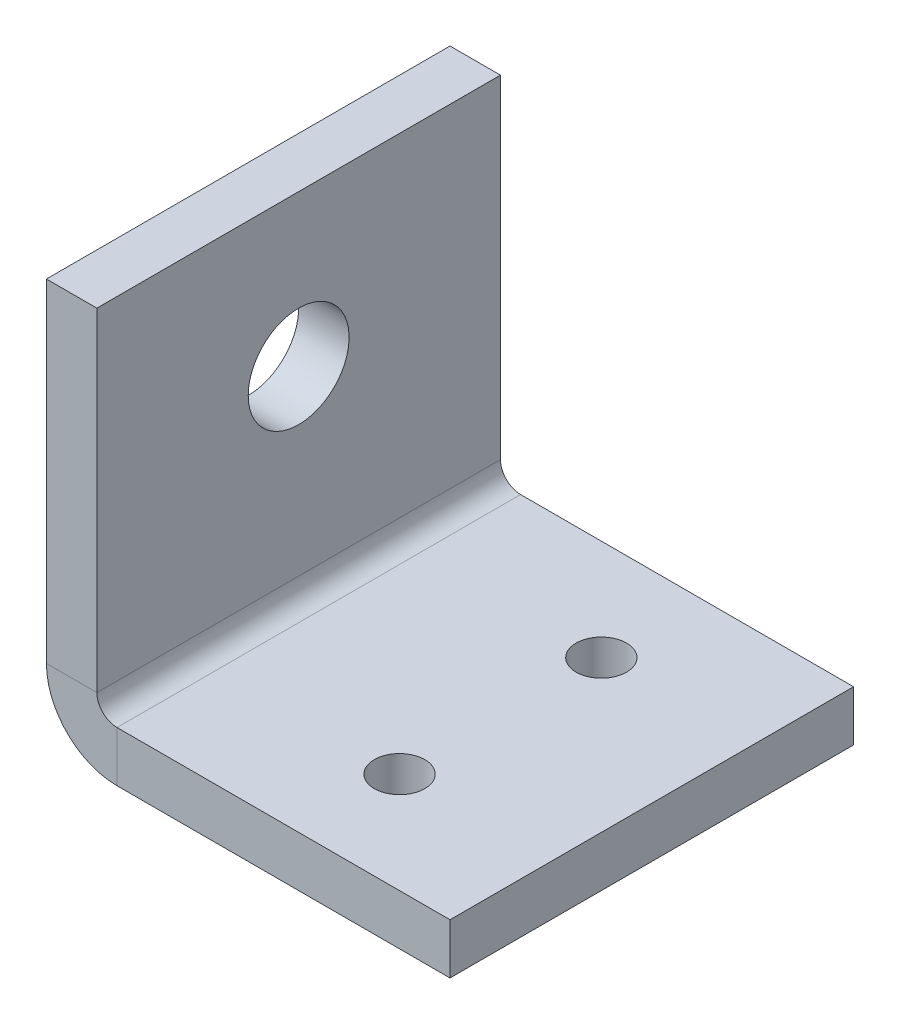
ISO-10303-21;
HEADER;
FILE_DESCRIPTION(('STEP AP214'),'2;1');
FILE_NAME('part.step','',(''),(''),'','','');
FILE_SCHEMA(('AUTOMOTIVE_DESIGN { 1 0 10303 214 1 1 1 1 }'));
ENDSEC;
DATA;
#1=APPLICATION_CONTEXT('core data for automotive mechanical design processes');
#2=APPLICATION_PROTOCOL_DEFINITION('international standard','automotive_design',2000,#1);
#3=PRODUCT_CONTEXT('',#1,'mechanical');
#4=PRODUCT('Part','Part','',(#3));
#5=PRODUCT_RELATED_PRODUCT_CATEGORY('part','',(#4));
#6=PRODUCT_DEFINITION_FORMATION('','',#4);
#7=PRODUCT_DEFINITION_CONTEXT('part definition',#1,'design');
#8=PRODUCT_DEFINITION('design','',#6,#7);
#9=PRODUCT_DEFINITION_SHAPE('','',#8);
#10=(LENGTH_UNIT() NAMED_UNIT(*) SI_UNIT(.MILLI.,.METRE.));
#11=(NAMED_UNIT(*) PLANE_ANGLE_UNIT() SI_UNIT($,.RADIAN.));
#12=(NAMED_UNIT(*) SI_UNIT($,.STERADIAN.) SOLID_ANGLE_UNIT());
#13=UNCERTAINTY_MEASURE_WITH_UNIT(LENGTH_MEASURE(1.E-05),#10,'distance_accuracy_value','');
#14=(GEOMETRIC_REPRESENTATION_CONTEXT(3) GLOBAL_UNCERTAINTY_ASSIGNED_CONTEXT((#13)) GLOBAL_UNIT_ASSIGNED_CONTEXT((#10,
#11,#12)) REPRESENTATION_CONTEXT('',''));
#15=CARTESIAN_POINT('',(0.,0.,0.));
#16=DIRECTION('',(0.,0.,1.));
#17=DIRECTION('',(1.,0.,0.));
#18=AXIS2_PLACEMENT_3D('',#15,#16,#17);
#19=CARTESIAN_POINT('',(-33.,0.,-20.));
#20=DIRECTION('',(0.,0.,-1.));
#21=DIRECTION('',(-1.,0.,0.));
#22=AXIS2_PLACEMENT_3D('',#19,#20,#21);
#23=PLANE('',#22);
#24=DIRECTION('',(0.,1.,0.));
#25=VECTOR('',#24,1.);
#26=CARTESIAN_POINT('',(-33.,0.,-20.));
#27=LINE('',#26,#25);
#28=CARTESIAN_POINT('',(-33.,0.,-20.));
#29=VERTEX_POINT('',#28);
#30=CARTESIAN_POINT('',(-33.,5.,-20.));
#31=VERTEX_POINT('',#30);
#32=EDGE_CURVE('E11',#29,#31,#27,.T.);
#33=ORIENTED_EDGE('',*,*,#32,.F.);
#34=CARTESIAN_POINT('',(-33.,7.,-20.));
#35=DIRECTION('',(0.,0.,1.));
#36=DIRECTION('',(1.,0.,0.));
#37=AXIS2_PLACEMENT_3D('',#34,#35,#36);
#38=CIRCLE('',#37,7.);
#39=CARTESIAN_POINT('',(-40.,7.,-20.));
#40=VERTEX_POINT('',#39);
#41=EDGE_CURVE('E218',#29,#40,#38,.F.);
#42=ORIENTED_EDGE('',*,*,#41,.T.);
#43=DIRECTION('',(-1.,0.,0.));
#44=VECTOR('',#43,1.);
#45=CARTESIAN_POINT('',(-35.,7.,-20.));
#46=LINE('',#45,#44);
#47=CARTESIAN_POINT('',(-35.,7.,-20.));
#48=VERTEX_POINT('',#47);
#49=EDGE_CURVE('E55',#48,#40,#46,.T.);
#50=ORIENTED_EDGE('',*,*,#49,.F.);
#51=CARTESIAN_POINT('',(-33.,7.,-20.));
#52=DIRECTION('',(0.,0.,1.));
#53=DIRECTION('',(1.,0.,0.));
#54=AXIS2_PLACEMENT_3D('',#51,#52,#53);
#55=CIRCLE('',#54,2.);
#56=EDGE_CURVE('E147',#31,#48,#55,.F.);
#57=ORIENTED_EDGE('',*,*,#56,.F.);
#58=EDGE_LOOP('',(#33,#42,#50,#57));
#59=FACE_BOUND('',#58,.T.);
#60=ADVANCED_FACE('F46',(#59),#23,.T.);
#61=CARTESIAN_POINT('',(-35.,7.,-20.));
#62=DIRECTION('',(0.,0.,-1.));
#63=DIRECTION('',(-1.,0.,0.));
#64=AXIS2_PLACEMENT_3D('',#61,#62,#63);
#65=PLANE('',#64);
#66=DIRECTION('',(-1.,0.,0.));
#67=VECTOR('',#66,1.);
#68=CARTESIAN_POINT('',(0.,0.,-20.));
#69=LINE('',#68,#67);
#70=CARTESIAN_POINT('',(0.,0.,-20.));
#71=VERTEX_POINT('',#70);
#72=EDGE_CURVE('E142',#71,#29,#69,.T.);
#73=ORIENTED_EDGE('',*,*,#72,.T.);
#74=ORIENTED_EDGE('',*,*,#32,.T.);
#75=DIRECTION('',(1.,0.,0.));
#76=VECTOR('',#75,1.);
#77=CARTESIAN_POINT('',(0.,5.,-20.));
#78=LINE('',#77,#76);
#79=CARTESIAN_POINT('',(0.,5.,-20.));
#80=VERTEX_POINT('',#79);
#81=EDGE_CURVE('E125',#80,#31,#78,.F.);
#82=ORIENTED_EDGE('',*,*,#81,.F.);
#83=DIRECTION('',(0.,-1.,0.));
#84=VECTOR('',#83,1.);
#85=CARTESIAN_POINT('',(0.,5.,-20.));
#86=LINE('',#85,#84);
#87=EDGE_CURVE('E135',#80,#71,#86,.T.);
#88=ORIENTED_EDGE('',*,*,#87,.T.);
#89=EDGE_LOOP('',(#73,#74,#82,#88));
#90=FACE_BOUND('',#89,.T.);
#91=ADVANCED_FACE('F144',(#90),#65,.T.);
#92=CARTESIAN_POINT('',(-40.,7.,20.));
#93=DIRECTION('',(0.,0.,1.));
#94=DIRECTION('',(1.,0.,0.));
#95=AXIS2_PLACEMENT_3D('',#92,#93,#94);
#96=PLANE('',#95);
#97=DIRECTION('',(1.,0.,0.));
#98=VECTOR('',#97,1.);
#99=CARTESIAN_POINT('',(-40.,7.,20.));
#100=LINE('',#99,#98);
#101=CARTESIAN_POINT('',(-40.,7.,20.));
#102=VERTEX_POINT('',#101);
#103=CARTESIAN_POINT('',(-35.,7.,20.));
#104=VERTEX_POINT('',#103);
#105=EDGE_CURVE('E97',#102,#104,#100,.T.);
#106=ORIENTED_EDGE('',*,*,#105,.F.);
#107=CARTESIAN_POINT('',(-33.,7.,20.));
#108=DIRECTION('',(0.,0.,1.));
#109=DIRECTION('',(1.,0.,0.));
#110=AXIS2_PLACEMENT_3D('',#107,#108,#109);
#111=CIRCLE('',#110,7.);
#112=CARTESIAN_POINT('',(-33.,0.,20.));
#113=VERTEX_POINT('',#112);
#114=EDGE_CURVE('E168',#113,#102,#111,.F.);
#115=ORIENTED_EDGE('',*,*,#114,.F.);
#116=DIRECTION('',(0.,-1.,0.));
#117=VECTOR('',#116,1.);
#118=CARTESIAN_POINT('',(-33.,5.,20.));
#119=LINE('',#118,#117);
#120=CARTESIAN_POINT('',(-33.,5.,20.));
#121=VERTEX_POINT('',#120);
#122=EDGE_CURVE('E90',#121,#113,#119,.T.);
#123=ORIENTED_EDGE('',*,*,#122,.F.);
#124=CARTESIAN_POINT('',(-33.,7.,20.));
#125=DIRECTION('',(0.,0.,1.));
#126=DIRECTION('',(1.,0.,0.));
#127=AXIS2_PLACEMENT_3D('',#124,#125,#126);
#128=CIRCLE('',#127,2.);
#129=EDGE_CURVE('E181',#121,#104,#128,.F.);
#130=ORIENTED_EDGE('',*,*,#129,.T.);
#131=EDGE_LOOP('',(#106,#115,#123,#130));
#132=FACE_BOUND('',#131,.T.);
#133=ADVANCED_FACE('F240',(#132),#96,.T.);
#134=CARTESIAN_POINT('',(-33.,5.,20.));
#135=DIRECTION('',(0.,0.,1.));
#136=DIRECTION('',(1.,0.,0.));
#137=AXIS2_PLACEMENT_3D('',#134,#135,#136);
#138=PLANE('',#137);
#139=DIRECTION('',(0.,1.,0.));
#140=VECTOR('',#139,1.);
#141=CARTESIAN_POINT('',(-40.,0.,20.));
#142=LINE('',#141,#140);
#143=CARTESIAN_POINT('',(-40.,40.,20.));
#144=VERTEX_POINT('',#143);
#145=EDGE_CURVE('E165',#102,#144,#142,.T.);
#146=ORIENTED_EDGE('',*,*,#145,.F.);
#147=ORIENTED_EDGE('',*,*,#105,.T.);
#148=DIRECTION('',(0.,1.,0.));
#149=VECTOR('',#148,1.);
#150=CARTESIAN_POINT('',(-35.,0.,20.));
#151=LINE('',#150,#149);
#152=CARTESIAN_POINT('',(-35.,40.,20.));
#153=VERTEX_POINT('',#152);
#154=EDGE_CURVE('E157',#104,#153,#151,.T.);
#155=ORIENTED_EDGE('',*,*,#154,.T.);
#156=DIRECTION('',(1.,0.,0.));
#157=VECTOR('',#156,1.);
#158=CARTESIAN_POINT('',(-40.,40.,20.));
#159=LINE('',#158,#157);
#160=EDGE_CURVE('E160',#144,#153,#159,.T.);
#161=ORIENTED_EDGE('',*,*,#160,.F.);
#162=EDGE_LOOP('',(#146,#147,#155,#161));
#163=FACE_BOUND('',#162,.T.);
#164=ADVANCED_FACE('F248',(#163),#138,.T.);
#165=CARTESIAN_POINT('',(-35.,0.,-20.));
#166=DIRECTION('',(1.,0.,0.));
#167=DIRECTION('',(0.,0.,-1.));
#168=AXIS2_PLACEMENT_3D('',#165,#166,#167);
#169=PLANE('',#168);
#170=CARTESIAN_POINT('',(-35.,25.,0.));
#171=DIRECTION('',(-1.,0.,0.));
#172=DIRECTION('',(0.,0.,1.));
#173=AXIS2_PLACEMENT_3D('',#170,#171,#172);
#174=CIRCLE('',#173,5.);
#175=CARTESIAN_POINT('',(-35.,25.,5.));
#176=VERTEX_POINT('',#175);
#177=EDGE_CURVE('E161',#176,#176,#174,.T.);
#178=ORIENTED_EDGE('',*,*,#177,.T.);
#179=EDGE_LOOP('',(#178));
#180=FACE_BOUND('',#179,.T.);
#181=ORIENTED_EDGE('',*,*,#154,.F.);
#182=DIRECTION('',(0.,0.,1.));
#183=VECTOR('',#182,1.);
#184=CARTESIAN_POINT('',(-35.,7.,-20.));
#185=LINE('',#184,#183);
#186=EDGE_CURVE('E185',#48,#104,#185,.T.);
#187=ORIENTED_EDGE('',*,*,#186,.F.);
#188=DIRECTION('',(0.,1.,0.));
#189=VECTOR('',#188,1.);
#190=CARTESIAN_POINT('',(-35.,0.,-20.));
#191=LINE('',#190,#189);
#192=CARTESIAN_POINT('',(-35.,40.,-20.));
#193=VERTEX_POINT('',#192);
#194=EDGE_CURVE('E184',#48,#193,#191,.T.);
#195=ORIENTED_EDGE('',*,*,#194,.T.);
#196=DIRECTION('',(0.,0.,1.));
#197=VECTOR('',#196,1.);
#198=CARTESIAN_POINT('',(-35.,40.,-20.));
#199=LINE('',#198,#197);
#200=EDGE_CURVE('E153',#193,#153,#199,.T.);
#201=ORIENTED_EDGE('',*,*,#200,.T.);
#202=EDGE_LOOP('',(#181,#187,#195,#201));
#203=FACE_BOUND('',#202,.T.);
#204=ADVANCED_FACE('F246',(#180,#203),#169,.T.);
#205=CARTESIAN_POINT('',(-33.,7.,-20.));
#206=DIRECTION('',(0.,0.,1.));
#207=DIRECTION('',(1.,0.,0.));
#208=AXIS2_PLACEMENT_3D('',#205,#206,#207);
#209=CYLINDRICAL_SURFACE('',#208,2.);
#210=ORIENTED_EDGE('',*,*,#129,.F.);
#211=DIRECTION('',(0.,0.,1.));
#212=VECTOR('',#211,1.);
#213=CARTESIAN_POINT('',(-33.,5.,-20.));
#214=LINE('',#213,#212);
#215=EDGE_CURVE('E131',#31,#121,#214,.T.);
#216=ORIENTED_EDGE('',*,*,#215,.F.);
#217=ORIENTED_EDGE('',*,*,#56,.T.);
#218=ORIENTED_EDGE('',*,*,#186,.T.);
#219=EDGE_LOOP('',(#210,#216,#217,#218));
#220=FACE_BOUND('',#219,.T.);
#221=ADVANCED_FACE('F243',(#220),#209,.F.);
#222=CARTESIAN_POINT('',(0.,5.,-20.));
#223=DIRECTION('',(0.,1.,0.));
#224=DIRECTION('',(0.,0.,1.));
#225=AXIS2_PLACEMENT_3D('',#222,#223,#224);
#226=PLANE('',#225);
#227=CARTESIAN_POINT('',(-15.,5.,-10.));
#228=DIRECTION('',(0.,1.,0.));
#229=DIRECTION('',(0.,0.,1.));
#230=AXIS2_PLACEMENT_3D('',#227,#228,#229);
#231=CIRCLE('',#230,2.5);
#232=CARTESIAN_POINT('',(-15.,5.,-7.5));
#233=VERTEX_POINT('',#232);
#234=EDGE_CURVE('E271',#233,#233,#231,.T.);
#235=ORIENTED_EDGE('',*,*,#234,.F.);
#236=EDGE_LOOP('',(#235));
#237=FACE_BOUND('',#236,.T.);
#238=CARTESIAN_POINT('',(-15.,5.,10.));
#239=DIRECTION('',(0.,1.,0.));
#240=DIRECTION('',(0.,0.,1.));
#241=AXIS2_PLACEMENT_3D('',#238,#239,#240);
#242=CIRCLE('',#241,2.5);
#243=CARTESIAN_POINT('',(-15.,5.,12.5));
#244=VERTEX_POINT('',#243);
#245=EDGE_CURVE('E267',#244,#244,#242,.T.);
#246=ORIENTED_EDGE('',*,*,#245,.F.);
#247=EDGE_LOOP('',(#246));
#248=FACE_BOUND('',#247,.T.);
#249=DIRECTION('',(1.,0.,0.));
#250=VECTOR('',#249,1.);
#251=CARTESIAN_POINT('',(0.,5.,20.));
#252=LINE('',#251,#250);
#253=CARTESIAN_POINT('',(0.,5.,20.));
#254=VERTEX_POINT('',#253);
#255=EDGE_CURVE('E127',#254,#121,#252,.F.);
#256=ORIENTED_EDGE('',*,*,#255,.F.);
#257=DIRECTION('',(0.,0.,1.));
#258=VECTOR('',#257,1.);
#259=CARTESIAN_POINT('',(0.,5.,-20.));
#260=LINE('',#259,#258);
#261=EDGE_CURVE('E121',#80,#254,#260,.T.);
#262=ORIENTED_EDGE('',*,*,#261,.F.);
#263=ORIENTED_EDGE('',*,*,#81,.T.);
#264=ORIENTED_EDGE('',*,*,#215,.T.);
#265=EDGE_LOOP('',(#256,#262,#263,#264));
#266=FACE_BOUND('',#265,.T.);
#267=ADVANCED_FACE('F123',(#237,#248,#266),#226,.T.);
#268=CARTESIAN_POINT('',(0.,5.,-20.));
#269=DIRECTION('',(-1.,0.,0.));
#270=DIRECTION('',(0.,0.,1.));
#271=AXIS2_PLACEMENT_3D('',#268,#269,#270);
#272=PLANE('',#271);
#273=DIRECTION('',(0.,-1.,0.));
#274=VECTOR('',#273,1.);
#275=CARTESIAN_POINT('',(0.,5.,20.));
#276=LINE('',#275,#274);
#277=CARTESIAN_POINT('',(0.,0.,20.));
#278=VERTEX_POINT('',#277);
#279=EDGE_CURVE('E176',#254,#278,#276,.T.);
#280=ORIENTED_EDGE('',*,*,#279,.T.);
#281=DIRECTION('',(0.,0.,1.));
#282=VECTOR('',#281,1.);
#283=CARTESIAN_POINT('',(0.,0.,-20.));
#284=LINE('',#283,#282);
#285=EDGE_CURVE('E132',#71,#278,#284,.T.);
#286=ORIENTED_EDGE('',*,*,#285,.F.);
#287=ORIENTED_EDGE('',*,*,#87,.F.);
#288=ORIENTED_EDGE('',*,*,#261,.T.);
#289=EDGE_LOOP('',(#280,#286,#287,#288));
#290=FACE_BOUND('',#289,.T.);
#291=ADVANCED_FACE('F136',(#290),#272,.F.);
#292=CARTESIAN_POINT('',(0.,0.,-20.));
#293=DIRECTION('',(0.,1.,0.));
#294=DIRECTION('',(0.,0.,1.));
#295=AXIS2_PLACEMENT_3D('',#292,#293,#294);
#296=PLANE('',#295);
#297=CARTESIAN_POINT('',(-15.,0.,-10.));
#298=DIRECTION('',(0.,1.,0.));
#299=DIRECTION('',(0.,0.,1.));
#300=AXIS2_PLACEMENT_3D('',#297,#298,#299);
#301=CIRCLE('',#300,2.5);
#302=CARTESIAN_POINT('',(-15.,0.,-7.5));
#303=VERTEX_POINT('',#302);
#304=EDGE_CURVE('E259',#303,#303,#301,.T.);
#305=ORIENTED_EDGE('',*,*,#304,.T.);
#306=EDGE_LOOP('',(#305));
#307=FACE_BOUND('',#306,.T.);
#308=CARTESIAN_POINT('',(-15.,0.,10.));
#309=DIRECTION('',(0.,1.,0.));
#310=DIRECTION('',(0.,0.,1.));
#311=AXIS2_PLACEMENT_3D('',#308,#309,#310);
#312=CIRCLE('',#311,2.5);
#313=CARTESIAN_POINT('',(-15.,0.,12.5));
#314=VERTEX_POINT('',#313);
#315=EDGE_CURVE('E263',#314,#314,#312,.T.);
#316=ORIENTED_EDGE('',*,*,#315,.T.);
#317=EDGE_LOOP('',(#316));
#318=FACE_BOUND('',#317,.T.);
#319=DIRECTION('',(-1.,0.,0.));
#320=VECTOR('',#319,1.);
#321=CARTESIAN_POINT('',(0.,0.,20.));
#322=LINE('',#321,#320);
#323=EDGE_CURVE('E172',#278,#113,#322,.T.);
#324=ORIENTED_EDGE('',*,*,#323,.T.);
#325=DIRECTION('',(0.,0.,1.));
#326=VECTOR('',#325,1.);
#327=CARTESIAN_POINT('',(-33.,0.,-20.));
#328=LINE('',#327,#326);
#329=EDGE_CURVE('E192',#29,#113,#328,.T.);
#330=ORIENTED_EDGE('',*,*,#329,.F.);
#331=ORIENTED_EDGE('',*,*,#72,.F.);
#332=ORIENTED_EDGE('',*,*,#285,.T.);
#333=EDGE_LOOP('',(#324,#330,#331,#332));
#334=FACE_BOUND('',#333,.T.);
#335=ADVANCED_FACE('F238',(#307,#318,#334),#296,.F.);
#336=CARTESIAN_POINT('',(-33.,7.,-20.));
#337=DIRECTION('',(0.,0.,1.));
#338=DIRECTION('',(1.,0.,0.));
#339=AXIS2_PLACEMENT_3D('',#336,#337,#338);
#340=CYLINDRICAL_SURFACE('',#339,7.);
#341=ORIENTED_EDGE('',*,*,#114,.T.);
#342=DIRECTION('',(0.,0.,1.));
#343=VECTOR('',#342,1.);
#344=CARTESIAN_POINT('',(-40.,7.,-20.));
#345=LINE('',#344,#343);
#346=EDGE_CURVE('E196',#40,#102,#345,.T.);
#347=ORIENTED_EDGE('',*,*,#346,.F.);
#348=ORIENTED_EDGE('',*,*,#41,.F.);
#349=ORIENTED_EDGE('',*,*,#329,.T.);
#350=EDGE_LOOP('',(#341,#347,#348,#349));
#351=FACE_BOUND('',#350,.T.);
#352=ADVANCED_FACE('F223',(#351),#340,.T.);
#353=CARTESIAN_POINT('',(-40.,0.,-20.));
#354=DIRECTION('',(1.,0.,0.));
#355=DIRECTION('',(0.,0.,-1.));
#356=AXIS2_PLACEMENT_3D('',#353,#354,#355);
#357=PLANE('',#356);
#358=CARTESIAN_POINT('',(-40.,25.,0.));
#359=DIRECTION('',(-1.,0.,0.));
#360=DIRECTION('',(0.,0.,1.));
#361=AXIS2_PLACEMENT_3D('',#358,#359,#360);
#362=CIRCLE('',#361,5.);
#363=CARTESIAN_POINT('',(-40.,25.,5.));
#364=VERTEX_POINT('',#363);
#365=EDGE_CURVE('E255',#364,#364,#362,.T.);
#366=ORIENTED_EDGE('',*,*,#365,.F.);
#367=EDGE_LOOP('',(#366));
#368=FACE_BOUND('',#367,.T.);
#369=ORIENTED_EDGE('',*,*,#145,.T.);
#370=DIRECTION('',(0.,0.,1.));
#371=VECTOR('',#370,1.);
#372=CARTESIAN_POINT('',(-40.,40.,-20.));
#373=LINE('',#372,#371);
#374=CARTESIAN_POINT('',(-40.,40.,-20.));
#375=VERTEX_POINT('',#374);
#376=EDGE_CURVE('E200',#375,#144,#373,.T.);
#377=ORIENTED_EDGE('',*,*,#376,.F.);
#378=DIRECTION('',(0.,1.,0.));
#379=VECTOR('',#378,1.);
#380=CARTESIAN_POINT('',(-40.,0.,-20.));
#381=LINE('',#380,#379);
#382=EDGE_CURVE('E214',#40,#375,#381,.T.);
#383=ORIENTED_EDGE('',*,*,#382,.F.);
#384=ORIENTED_EDGE('',*,*,#346,.T.);
#385=EDGE_LOOP('',(#369,#377,#383,#384));
#386=FACE_BOUND('',#385,.T.);
#387=ADVANCED_FACE('F225',(#368,#386),#357,.F.);
#388=CARTESIAN_POINT('',(-40.,40.,-20.));
#389=DIRECTION('',(0.,-1.,0.));
#390=DIRECTION('',(0.,0.,-1.));
#391=AXIS2_PLACEMENT_3D('',#388,#389,#390);
#392=PLANE('',#391);
#393=ORIENTED_EDGE('',*,*,#160,.T.);
#394=ORIENTED_EDGE('',*,*,#200,.F.);
#395=DIRECTION('',(1.,0.,0.));
#396=VECTOR('',#395,1.);
#397=CARTESIAN_POINT('',(-40.,40.,-20.));
#398=LINE('',#397,#396);
#399=EDGE_CURVE('E106',#375,#193,#398,.T.);
#400=ORIENTED_EDGE('',*,*,#399,.F.);
#401=ORIENTED_EDGE('',*,*,#376,.T.);
#402=EDGE_LOOP('',(#393,#394,#400,#401));
#403=FACE_BOUND('',#402,.T.);
#404=ADVANCED_FACE('F250',(#403),#392,.F.);
#405=CARTESIAN_POINT('',(-33.,7.,-20.));
#406=DIRECTION('',(0.,0.,1.));
#407=DIRECTION('',(1.,0.,0.));
#408=AXIS2_PLACEMENT_3D('',#405,#406,#407);
#409=PLANE('',#408);
#410=ORIENTED_EDGE('',*,*,#194,.F.);
#411=ORIENTED_EDGE('',*,*,#49,.T.);
#412=ORIENTED_EDGE('',*,*,#382,.T.);
#413=ORIENTED_EDGE('',*,*,#399,.T.);
#414=EDGE_LOOP('',(#410,#411,#412,#413));
#415=FACE_BOUND('',#414,.T.);
#416=ADVANCED_FACE('F212',(#415),#409,.F.);
#417=CARTESIAN_POINT('',(-33.,7.,20.));
#418=DIRECTION('',(0.,0.,1.));
#419=DIRECTION('',(1.,0.,0.));
#420=AXIS2_PLACEMENT_3D('',#417,#418,#419);
#421=PLANE('',#420);
#422=ORIENTED_EDGE('',*,*,#255,.T.);
#423=ORIENTED_EDGE('',*,*,#122,.T.);
#424=ORIENTED_EDGE('',*,*,#323,.F.);
#425=ORIENTED_EDGE('',*,*,#279,.F.);
#426=EDGE_LOOP('',(#422,#423,#424,#425));
#427=FACE_BOUND('',#426,.T.);
#428=ADVANCED_FACE('F302',(#427),#421,.T.);
#429=CARTESIAN_POINT('',(-35.,25.,0.));
#430=DIRECTION('',(-1.,0.,0.));
#431=DIRECTION('',(0.,0.,1.));
#432=AXIS2_PLACEMENT_3D('',#429,#430,#431);
#433=CYLINDRICAL_SURFACE('',#432,5.);
#434=ORIENTED_EDGE('',*,*,#177,.F.);
#435=EDGE_LOOP('',(#434));
#436=FACE_BOUND('',#435,.T.);
#437=ORIENTED_EDGE('',*,*,#365,.T.);
#438=EDGE_LOOP('',(#437));
#439=FACE_BOUND('',#438,.T.);
#440=ADVANCED_FACE('F296',(#436,#439),#433,.F.);
#441=CARTESIAN_POINT('',(-15.,0.,10.));
#442=DIRECTION('',(0.,1.,0.));
#443=DIRECTION('',(0.,0.,1.));
#444=AXIS2_PLACEMENT_3D('',#441,#442,#443);
#445=CYLINDRICAL_SURFACE('',#444,2.5);
#446=ORIENTED_EDGE('',*,*,#315,.F.);
#447=EDGE_LOOP('',(#446));
#448=FACE_BOUND('',#447,.T.);
#449=ORIENTED_EDGE('',*,*,#245,.T.);
#450=EDGE_LOOP('',(#449));
#451=FACE_BOUND('',#450,.T.);
#452=ADVANCED_FACE('F286',(#448,#451),#445,.F.);
#453=CARTESIAN_POINT('',(-15.,0.,-10.));
#454=DIRECTION('',(0.,1.,0.));
#455=DIRECTION('',(0.,0.,1.));
#456=AXIS2_PLACEMENT_3D('',#453,#454,#455);
#457=CYLINDRICAL_SURFACE('',#456,2.5);
#458=ORIENTED_EDGE('',*,*,#304,.F.);
#459=EDGE_LOOP('',(#458));
#460=FACE_BOUND('',#459,.T.);
#461=ORIENTED_EDGE('',*,*,#234,.T.);
#462=EDGE_LOOP('',(#461));
#463=FACE_BOUND('',#462,.T.);
#464=ADVANCED_FACE('F283',(#460,#463),#457,.F.);
#465=CLOSED_SHELL('',(#60,#91,#133,#164,#204,#221,#267,#291,#335,#352,#387,#404,#416,#428,#440,
#452,#464));
#466=MANIFOLD_SOLID_BREP('B2',#465);
#467=ADVANCED_BREP_SHAPE_REPRESENTATION('',(#18,#466),#14);
#468=SHAPE_DEFINITION_REPRESENTATION(#9,#467);
ENDSEC;
END-ISO-10303-21;
